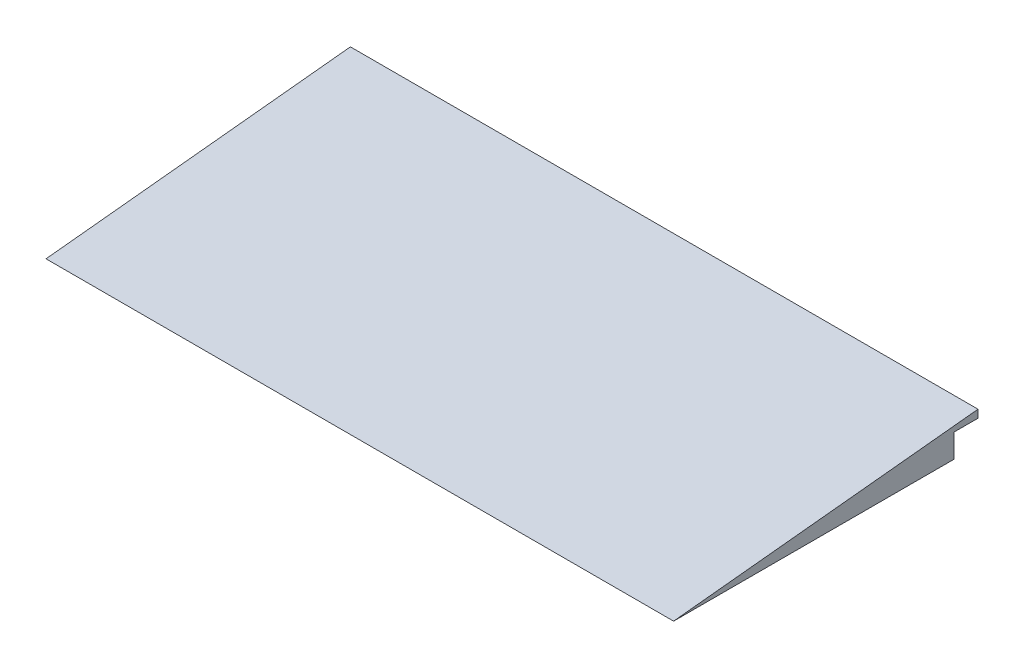
ISO-10303-21;
HEADER;
FILE_DESCRIPTION(('STEP AP214'),'2;1');
FILE_NAME('part.step','',(''),(''),'','','');
FILE_SCHEMA(('AUTOMOTIVE_DESIGN { 1 0 10303 214 1 1 1 1 }'));
ENDSEC;
DATA;
#1=APPLICATION_CONTEXT('core data for automotive mechanical design processes');
#2=APPLICATION_PROTOCOL_DEFINITION('international standard','automotive_design',2000,#1);
#3=PRODUCT_CONTEXT('',#1,'mechanical');
#4=PRODUCT('Part','Part','',(#3));
#5=PRODUCT_RELATED_PRODUCT_CATEGORY('part','',(#4));
#6=PRODUCT_DEFINITION_FORMATION('','',#4);
#7=PRODUCT_DEFINITION_CONTEXT('part definition',#1,'design');
#8=PRODUCT_DEFINITION('design','',#6,#7);
#9=PRODUCT_DEFINITION_SHAPE('','',#8);
#10=(LENGTH_UNIT() NAMED_UNIT(*) SI_UNIT(.MILLI.,.METRE.));
#11=(NAMED_UNIT(*) PLANE_ANGLE_UNIT() SI_UNIT($,.RADIAN.));
#12=(NAMED_UNIT(*) SI_UNIT($,.STERADIAN.) SOLID_ANGLE_UNIT());
#13=UNCERTAINTY_MEASURE_WITH_UNIT(LENGTH_MEASURE(1.E-05),#10,'distance_accuracy_value','');
#14=(GEOMETRIC_REPRESENTATION_CONTEXT(3) GLOBAL_UNCERTAINTY_ASSIGNED_CONTEXT((#13)) GLOBAL_UNIT_ASSIGNED_CONTEXT((#10,
#11,#12)) REPRESENTATION_CONTEXT('',''));
#15=CARTESIAN_POINT('',(0.,0.,0.));
#16=DIRECTION('',(0.,0.,1.));
#17=DIRECTION('',(1.,0.,0.));
#18=AXIS2_PLACEMENT_3D('',#15,#16,#17);
#19=CARTESIAN_POINT('',(100.,0.,-48.5));
#20=DIRECTION('',(0.,1.,0.));
#21=DIRECTION('',(0.,0.,1.));
#22=AXIS2_PLACEMENT_3D('',#19,#20,#21);
#23=PLANE('',#22);
#24=DIRECTION('',(0.,0.,-1.));
#25=VECTOR('',#24,1.);
#26=CARTESIAN_POINT('',(-100.,0.,-48.5));
#27=LINE('',#26,#25);
#28=CARTESIAN_POINT('',(-100.,0.,48.5));
#29=VERTEX_POINT('',#28);
#30=CARTESIAN_POINT('',(-100.,0.,-40.8));
#31=VERTEX_POINT('',#30);
#32=EDGE_CURVE('E87',#29,#31,#27,.T.);
#33=ORIENTED_EDGE('',*,*,#32,.T.);
#34=DIRECTION('',(1.,0.,0.));
#35=VECTOR('',#34,1.);
#36=CARTESIAN_POINT('',(-100.,0.,-40.8));
#37=LINE('',#36,#35);
#38=CARTESIAN_POINT('',(100.,0.,-40.8));
#39=VERTEX_POINT('',#38);
#40=EDGE_CURVE('E90',#31,#39,#37,.T.);
#41=ORIENTED_EDGE('',*,*,#40,.T.);
#42=DIRECTION('',(0.,0.,-1.));
#43=VECTOR('',#42,1.);
#44=CARTESIAN_POINT('',(100.,0.,-48.5));
#45=LINE('',#44,#43);
#46=CARTESIAN_POINT('',(100.,0.,48.5));
#47=VERTEX_POINT('',#46);
#48=EDGE_CURVE('E81',#47,#39,#45,.T.);
#49=ORIENTED_EDGE('',*,*,#48,.F.);
#50=DIRECTION('',(-1.,0.,0.));
#51=VECTOR('',#50,1.);
#52=CARTESIAN_POINT('',(100.,0.,48.5));
#53=LINE('',#52,#51);
#54=EDGE_CURVE('E45',#47,#29,#53,.T.);
#55=ORIENTED_EDGE('',*,*,#54,.T.);
#56=EDGE_LOOP('',(#33,#41,#49,#55));
#57=FACE_BOUND('',#56,.T.);
#58=ADVANCED_FACE('F38',(#57),#23,.F.);
#59=CARTESIAN_POINT('',(100.,9.99999999999999,-48.5));
#60=DIRECTION('',(0.,0.,1.));
#61=DIRECTION('',(1.,0.,0.));
#62=AXIS2_PLACEMENT_3D('',#59,#60,#61);
#63=PLANE('',#62);
#64=DIRECTION('',(0.,1.,0.));
#65=VECTOR('',#64,1.);
#66=CARTESIAN_POINT('',(100.,9.99999999999999,-48.5));
#67=LINE('',#66,#65);
#68=CARTESIAN_POINT('',(100.,7.5,-48.5));
#69=VERTEX_POINT('',#68);
#70=CARTESIAN_POINT('',(100.,9.99999999999999,-48.5));
#71=VERTEX_POINT('',#70);
#72=EDGE_CURVE('E97',#69,#71,#67,.T.);
#73=ORIENTED_EDGE('',*,*,#72,.F.);
#74=DIRECTION('',(1.,0.,0.));
#75=VECTOR('',#74,1.);
#76=CARTESIAN_POINT('',(-100.,7.5,-48.5));
#77=LINE('',#76,#75);
#78=CARTESIAN_POINT('',(-100.,7.5,-48.5));
#79=VERTEX_POINT('',#78);
#80=EDGE_CURVE('E100',#79,#69,#77,.T.);
#81=ORIENTED_EDGE('',*,*,#80,.F.);
#82=DIRECTION('',(0.,1.,0.));
#83=VECTOR('',#82,1.);
#84=CARTESIAN_POINT('',(-100.,9.99999999999999,-48.5));
#85=LINE('',#84,#83);
#86=CARTESIAN_POINT('',(-100.,9.99999999999999,-48.5));
#87=VERTEX_POINT('',#86);
#88=EDGE_CURVE('E82',#79,#87,#85,.T.);
#89=ORIENTED_EDGE('',*,*,#88,.T.);
#90=DIRECTION('',(-1.,0.,0.));
#91=VECTOR('',#90,1.);
#92=CARTESIAN_POINT('',(100.,9.99999999999999,-48.5));
#93=LINE('',#92,#91);
#94=EDGE_CURVE('E11',#71,#87,#93,.T.);
#95=ORIENTED_EDGE('',*,*,#94,.F.);
#96=EDGE_LOOP('',(#73,#81,#89,#95));
#97=FACE_BOUND('',#96,.T.);
#98=ADVANCED_FACE('F123',(#97),#63,.F.);
#99=CARTESIAN_POINT('',(100.,0.,48.5));
#100=DIRECTION('',(0.,-0.994727926154281,-0.102549270737555));
#101=DIRECTION('',(0.,0.102549270737555,-0.994727926154281));
#102=AXIS2_PLACEMENT_3D('',#99,#100,#101);
#103=PLANE('',#102);
#104=DIRECTION('',(0.,-0.102549270737555,0.99472792615428));
#105=VECTOR('',#104,1.);
#106=CARTESIAN_POINT('',(-100.,0.,48.5));
#107=LINE('',#106,#105);
#108=EDGE_CURVE('E73',#87,#29,#107,.T.);
#109=ORIENTED_EDGE('',*,*,#108,.T.);
#110=ORIENTED_EDGE('',*,*,#54,.F.);
#111=DIRECTION('',(0.,-0.102549270737555,0.99472792615428));
#112=VECTOR('',#111,1.);
#113=CARTESIAN_POINT('',(100.,0.,48.5));
#114=LINE('',#113,#112);
#115=EDGE_CURVE('E61',#71,#47,#114,.T.);
#116=ORIENTED_EDGE('',*,*,#115,.F.);
#117=ORIENTED_EDGE('',*,*,#94,.T.);
#118=EDGE_LOOP('',(#109,#110,#116,#117));
#119=FACE_BOUND('',#118,.T.);
#120=ADVANCED_FACE('F75',(#119),#103,.F.);
#121=CARTESIAN_POINT('',(100.,0.,0.));
#122=DIRECTION('',(1.,0.,0.));
#123=DIRECTION('',(0.,0.,-1.));
#124=AXIS2_PLACEMENT_3D('',#121,#122,#123);
#125=PLANE('',#124);
#126=DIRECTION('',(0.,-1.,0.));
#127=VECTOR('',#126,1.);
#128=CARTESIAN_POINT('',(100.,0.,-40.8));
#129=LINE('',#128,#127);
#130=CARTESIAN_POINT('',(100.,7.5,-40.8));
#131=VERTEX_POINT('',#130);
#132=EDGE_CURVE('E104',#131,#39,#129,.T.);
#133=ORIENTED_EDGE('',*,*,#132,.F.);
#134=DIRECTION('',(0.,0.,1.));
#135=VECTOR('',#134,1.);
#136=CARTESIAN_POINT('',(100.,7.5,-48.5));
#137=LINE('',#136,#135);
#138=EDGE_CURVE('E108',#69,#131,#137,.T.);
#139=ORIENTED_EDGE('',*,*,#138,.F.);
#140=ORIENTED_EDGE('',*,*,#72,.T.);
#141=ORIENTED_EDGE('',*,*,#115,.T.);
#142=ORIENTED_EDGE('',*,*,#48,.T.);
#143=EDGE_LOOP('',(#133,#139,#140,#141,#142));
#144=FACE_BOUND('',#143,.T.);
#145=ADVANCED_FACE('F127',(#144),#125,.T.);
#146=CARTESIAN_POINT('',(-100.,0.,0.));
#147=DIRECTION('',(1.,0.,0.));
#148=DIRECTION('',(0.,0.,-1.));
#149=AXIS2_PLACEMENT_3D('',#146,#147,#148);
#150=PLANE('',#149);
#151=DIRECTION('',(0.,0.,1.));
#152=VECTOR('',#151,1.);
#153=CARTESIAN_POINT('',(-100.,7.5,-48.5));
#154=LINE('',#153,#152);
#155=CARTESIAN_POINT('',(-100.,7.5,-40.8));
#156=VERTEX_POINT('',#155);
#157=EDGE_CURVE('E107',#79,#156,#154,.T.);
#158=ORIENTED_EDGE('',*,*,#157,.T.);
#159=DIRECTION('',(0.,-1.,0.));
#160=VECTOR('',#159,1.);
#161=CARTESIAN_POINT('',(-100.,0.,-40.8));
#162=LINE('',#161,#160);
#163=EDGE_CURVE('E52',#156,#31,#162,.T.);
#164=ORIENTED_EDGE('',*,*,#163,.T.);
#165=ORIENTED_EDGE('',*,*,#32,.F.);
#166=ORIENTED_EDGE('',*,*,#108,.F.);
#167=ORIENTED_EDGE('',*,*,#88,.F.);
#168=EDGE_LOOP('',(#158,#164,#165,#166,#167));
#169=FACE_BOUND('',#168,.T.);
#170=ADVANCED_FACE('F89',(#169),#150,.F.);
#171=CARTESIAN_POINT('',(-100.,0.,-40.8));
#172=DIRECTION('',(0.,0.,1.));
#173=DIRECTION('',(1.,0.,0.));
#174=AXIS2_PLACEMENT_3D('',#171,#172,#173);
#175=PLANE('',#174);
#176=ORIENTED_EDGE('',*,*,#132,.T.);
#177=ORIENTED_EDGE('',*,*,#40,.F.);
#178=ORIENTED_EDGE('',*,*,#163,.F.);
#179=DIRECTION('',(1.,0.,0.));
#180=VECTOR('',#179,1.);
#181=CARTESIAN_POINT('',(-100.,7.5,-40.8));
#182=LINE('',#181,#180);
#183=EDGE_CURVE('E93',#156,#131,#182,.T.);
#184=ORIENTED_EDGE('',*,*,#183,.T.);
#185=EDGE_LOOP('',(#176,#177,#178,#184));
#186=FACE_BOUND('',#185,.T.);
#187=ADVANCED_FACE('F130',(#186),#175,.F.);
#188=CARTESIAN_POINT('',(-100.,7.5,-48.5));
#189=DIRECTION('',(0.,1.,0.));
#190=DIRECTION('',(0.,0.,1.));
#191=AXIS2_PLACEMENT_3D('',#188,#189,#190);
#192=PLANE('',#191);
#193=ORIENTED_EDGE('',*,*,#138,.T.);
#194=ORIENTED_EDGE('',*,*,#183,.F.);
#195=ORIENTED_EDGE('',*,*,#157,.F.);
#196=ORIENTED_EDGE('',*,*,#80,.T.);
#197=EDGE_LOOP('',(#193,#194,#195,#196));
#198=FACE_BOUND('',#197,.T.);
#199=ADVANCED_FACE('F116',(#198),#192,.F.);
#200=CLOSED_SHELL('',(#58,#98,#120,#145,#170,#187,#199));
#201=MANIFOLD_SOLID_BREP('B2',#200);
#202=ADVANCED_BREP_SHAPE_REPRESENTATION('',(#18,#201),#14);
#203=SHAPE_DEFINITION_REPRESENTATION(#9,#202);
ENDSEC;
END-ISO-10303-21;
